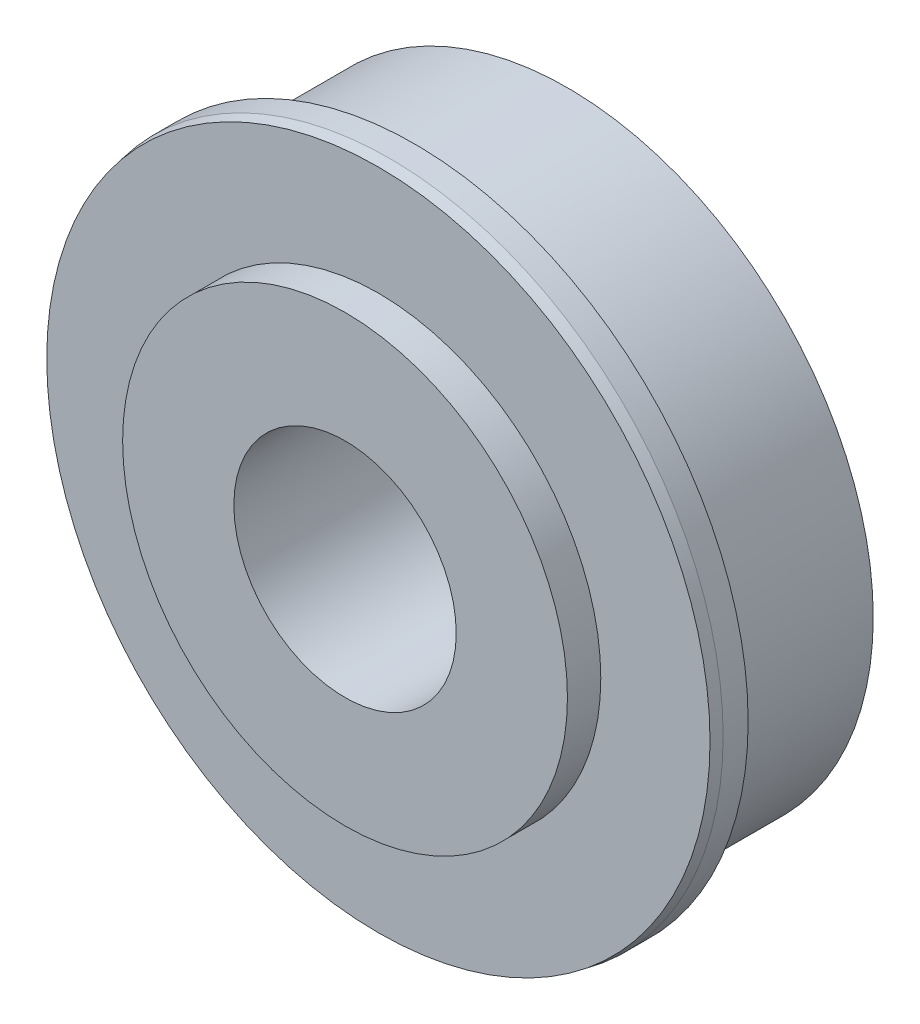
ISO-10303-21;
HEADER;
FILE_DESCRIPTION(('STEP AP214'),'2;1');
FILE_NAME('part.step','',(''),(''),'','','');
FILE_SCHEMA(('AUTOMOTIVE_DESIGN { 1 0 10303 214 1 1 1 1 }'));
ENDSEC;
DATA;
#1=APPLICATION_CONTEXT('core data for automotive mechanical design processes');
#2=APPLICATION_PROTOCOL_DEFINITION('international standard','automotive_design',2000,#1);
#3=PRODUCT_CONTEXT('',#1,'mechanical');
#4=PRODUCT('Part','Part','',(#3));
#5=PRODUCT_RELATED_PRODUCT_CATEGORY('part','',(#4));
#6=PRODUCT_DEFINITION_FORMATION('','',#4);
#7=PRODUCT_DEFINITION_CONTEXT('part definition',#1,'design');
#8=PRODUCT_DEFINITION('design','',#6,#7);
#9=PRODUCT_DEFINITION_SHAPE('','',#8);
#10=(LENGTH_UNIT() NAMED_UNIT(*) SI_UNIT(.MILLI.,.METRE.));
#11=(NAMED_UNIT(*) PLANE_ANGLE_UNIT() SI_UNIT($,.RADIAN.));
#12=(NAMED_UNIT(*) SI_UNIT($,.STERADIAN.) SOLID_ANGLE_UNIT());
#13=UNCERTAINTY_MEASURE_WITH_UNIT(LENGTH_MEASURE(1.E-05),#10,'distance_accuracy_value','');
#14=(GEOMETRIC_REPRESENTATION_CONTEXT(3) GLOBAL_UNCERTAINTY_ASSIGNED_CONTEXT((#13)) GLOBAL_UNIT_ASSIGNED_CONTEXT((#10,
#11,#12)) REPRESENTATION_CONTEXT('',''));
#15=CARTESIAN_POINT('',(0.,0.,0.));
#16=DIRECTION('',(0.,0.,1.));
#17=DIRECTION('',(1.,0.,0.));
#18=AXIS2_PLACEMENT_3D('',#15,#16,#17);
#19=CARTESIAN_POINT('',(17.4625,0.,-6.35));
#20=DIRECTION('',(0.,0.,-1.));
#21=DIRECTION('',(-1.,0.,0.));
#22=AXIS2_PLACEMENT_3D('',#19,#20,#21);
#23=PLANE('',#22);
#24=CARTESIAN_POINT('',(0.,0.,-6.34999999999999));
#25=DIRECTION('',(0.,0.,1.));
#26=DIRECTION('',(1.,0.,0.));
#27=AXIS2_PLACEMENT_3D('',#24,#25,#26);
#28=CIRCLE('',#27,6.34999999999998);
#29=CARTESIAN_POINT('',(6.34999999999998,0.,-6.34999999999999));
#30=VERTEX_POINT('',#29);
#31=EDGE_CURVE('E72',#30,#30,#28,.T.);
#32=ORIENTED_EDGE('',*,*,#31,.T.);
#33=EDGE_LOOP('',(#32));
#34=FACE_BOUND('',#33,.T.);
#35=CARTESIAN_POINT('',(0.,0.,-6.34999999999999));
#36=DIRECTION('',(0.,0.,1.));
#37=DIRECTION('',(1.,0.,0.));
#38=AXIS2_PLACEMENT_3D('',#35,#36,#37);
#39=CIRCLE('',#38,17.4625);
#40=CARTESIAN_POINT('',(17.4625,0.,-6.34999999999999));
#41=VERTEX_POINT('',#40);
#42=EDGE_CURVE('E10',#41,#41,#39,.T.);
#43=ORIENTED_EDGE('',*,*,#42,.F.);
#44=EDGE_LOOP('',(#43));
#45=FACE_BOUND('',#44,.T.);
#46=ADVANCED_FACE('F40',(#34,#45),#23,.T.);
#47=CARTESIAN_POINT('',(0.,0.,114.851664885803));
#48=DIRECTION('',(0.,0.,1.));
#49=DIRECTION('',(1.,0.,0.));
#50=AXIS2_PLACEMENT_3D('',#47,#48,#49);
#51=CYLINDRICAL_SURFACE('',#50,17.4625);
#52=ORIENTED_EDGE('',*,*,#42,.T.);
#53=EDGE_LOOP('',(#52));
#54=FACE_BOUND('',#53,.T.);
#55=CARTESIAN_POINT('',(0.,0.,1.74625));
#56=DIRECTION('',(0.,0.,1.));
#57=DIRECTION('',(1.,0.,0.));
#58=AXIS2_PLACEMENT_3D('',#55,#56,#57);
#59=CIRCLE('',#58,17.4625);
#60=CARTESIAN_POINT('',(17.4625,0.,1.74625));
#61=VERTEX_POINT('',#60);
#62=EDGE_CURVE('E43',#61,#61,#59,.T.);
#63=ORIENTED_EDGE('',*,*,#62,.F.);
#64=EDGE_LOOP('',(#63));
#65=FACE_BOUND('',#64,.T.);
#66=ADVANCED_FACE('F87',(#54,#65),#51,.T.);
#67=CARTESIAN_POINT('',(0.,0.,2.38125));
#68=DIRECTION('',(0.,0.,-1.));
#69=DIRECTION('',(-1.,0.,0.));
#70=AXIS2_PLACEMENT_3D('',#67,#68,#69);
#71=CONICAL_SURFACE('',#70,17.3505323672501,0.174532925199432);
#72=ORIENTED_EDGE('',*,*,#62,.T.);
#73=EDGE_LOOP('',(#72));
#74=FACE_BOUND('',#73,.T.);
#75=CARTESIAN_POINT('',(0.,0.,2.38125));
#76=DIRECTION('',(0.,0.,1.));
#77=DIRECTION('',(1.,0.,0.));
#78=AXIS2_PLACEMENT_3D('',#75,#76,#77);
#79=CIRCLE('',#78,17.3505323672501);
#80=CARTESIAN_POINT('',(17.3505323672501,0.,2.38125));
#81=VERTEX_POINT('',#80);
#82=EDGE_CURVE('E50',#81,#81,#79,.T.);
#83=ORIENTED_EDGE('',*,*,#82,.F.);
#84=EDGE_LOOP('',(#83));
#85=FACE_BOUND('',#84,.T.);
#86=ADVANCED_FACE('F93',(#74,#85),#71,.T.);
#87=CARTESIAN_POINT('',(17.3505323672501,0.,2.38125));
#88=DIRECTION('',(0.,0.,-1.));
#89=DIRECTION('',(-1.,0.,0.));
#90=AXIS2_PLACEMENT_3D('',#87,#88,#89);
#91=PLANE('',#90);
#92=ORIENTED_EDGE('',*,*,#82,.T.);
#93=EDGE_LOOP('',(#92));
#94=FACE_BOUND('',#93,.T.);
#95=CARTESIAN_POINT('',(0.,0.,2.38125));
#96=DIRECTION('',(0.,0.,1.));
#97=DIRECTION('',(1.,0.,0.));
#98=AXIS2_PLACEMENT_3D('',#95,#96,#97);
#99=CIRCLE('',#98,19.05);
#100=CARTESIAN_POINT('',(19.05,0.,2.38125));
#101=VERTEX_POINT('',#100);
#102=EDGE_CURVE('E51',#101,#101,#99,.T.);
#103=ORIENTED_EDGE('',*,*,#102,.F.);
#104=EDGE_LOOP('',(#103));
#105=FACE_BOUND('',#104,.T.);
#106=ADVANCED_FACE('F100',(#94,#105),#91,.T.);
#107=CARTESIAN_POINT('',(0.,0.,114.851664885803));
#108=DIRECTION('',(0.,0.,1.));
#109=DIRECTION('',(1.,0.,0.));
#110=AXIS2_PLACEMENT_3D('',#107,#108,#109);
#111=CYLINDRICAL_SURFACE('',#110,19.05);
#112=ORIENTED_EDGE('',*,*,#102,.T.);
#113=EDGE_LOOP('',(#112));
#114=FACE_BOUND('',#113,.T.);
#115=CARTESIAN_POINT('',(0.,0.,3.80999999999999));
#116=DIRECTION('',(0.,0.,1.));
#117=DIRECTION('',(1.,0.,0.));
#118=AXIS2_PLACEMENT_3D('',#115,#116,#117);
#119=CIRCLE('',#118,19.05);
#120=CARTESIAN_POINT('',(19.05,0.,3.80999999999999));
#121=VERTEX_POINT('',#120);
#122=EDGE_CURVE('E57',#121,#121,#119,.T.);
#123=ORIENTED_EDGE('',*,*,#122,.F.);
#124=EDGE_LOOP('',(#123));
#125=FACE_BOUND('',#124,.T.);
#126=ADVANCED_FACE('F104',(#114,#125),#111,.T.);
#127=CARTESIAN_POINT('',(0.,0.,4.445));
#128=DIRECTION('',(0.,0.,-1.));
#129=DIRECTION('',(-1.,0.,0.));
#130=AXIS2_PLACEMENT_3D('',#127,#128,#129);
#131=CONICAL_SURFACE('',#130,18.9380323672501,0.174532925199434);
#132=ORIENTED_EDGE('',*,*,#122,.T.);
#133=EDGE_LOOP('',(#132));
#134=FACE_BOUND('',#133,.T.);
#135=CARTESIAN_POINT('',(0.,0.,4.445));
#136=DIRECTION('',(0.,0.,1.));
#137=DIRECTION('',(1.,0.,0.));
#138=AXIS2_PLACEMENT_3D('',#135,#136,#137);
#139=CIRCLE('',#138,18.9380323672501);
#140=CARTESIAN_POINT('',(18.9380323672501,0.,4.445));
#141=VERTEX_POINT('',#140);
#142=EDGE_CURVE('E56',#141,#141,#139,.T.);
#143=ORIENTED_EDGE('',*,*,#142,.F.);
#144=EDGE_LOOP('',(#143));
#145=FACE_BOUND('',#144,.T.);
#146=ADVANCED_FACE('F109',(#134,#145),#131,.T.);
#147=CARTESIAN_POINT('',(18.9380323672501,0.,4.445));
#148=DIRECTION('',(0.,0.,1.));
#149=DIRECTION('',(1.,0.,0.));
#150=AXIS2_PLACEMENT_3D('',#147,#148,#149);
#151=PLANE('',#150);
#152=ORIENTED_EDGE('',*,*,#142,.T.);
#153=EDGE_LOOP('',(#152));
#154=FACE_BOUND('',#153,.T.);
#155=CARTESIAN_POINT('',(0.,0.,4.445));
#156=DIRECTION('',(0.,0.,1.));
#157=DIRECTION('',(1.,0.,0.));
#158=AXIS2_PLACEMENT_3D('',#155,#156,#157);
#159=CIRCLE('',#158,12.7);
#160=CARTESIAN_POINT('',(12.7,0.,4.445));
#161=VERTEX_POINT('',#160);
#162=EDGE_CURVE('E64',#161,#161,#159,.T.);
#163=ORIENTED_EDGE('',*,*,#162,.F.);
#164=EDGE_LOOP('',(#163));
#165=FACE_BOUND('',#164,.T.);
#166=ADVANCED_FACE('F112',(#154,#165),#151,.T.);
#167=CARTESIAN_POINT('',(0.,0.,114.851664885803));
#168=DIRECTION('',(0.,0.,1.));
#169=DIRECTION('',(1.,0.,0.));
#170=AXIS2_PLACEMENT_3D('',#167,#168,#169);
#171=CYLINDRICAL_SURFACE('',#170,12.7);
#172=ORIENTED_EDGE('',*,*,#162,.T.);
#173=EDGE_LOOP('',(#172));
#174=FACE_BOUND('',#173,.T.);
#175=CARTESIAN_POINT('',(0.,0.,6.34999999999999));
#176=DIRECTION('',(0.,0.,1.));
#177=DIRECTION('',(1.,0.,0.));
#178=AXIS2_PLACEMENT_3D('',#175,#176,#177);
#179=CIRCLE('',#178,12.7);
#180=CARTESIAN_POINT('',(12.7,0.,6.34999999999999));
#181=VERTEX_POINT('',#180);
#182=EDGE_CURVE('E63',#181,#181,#179,.T.);
#183=ORIENTED_EDGE('',*,*,#182,.F.);
#184=EDGE_LOOP('',(#183));
#185=FACE_BOUND('',#184,.T.);
#186=ADVANCED_FACE('F82',(#174,#185),#171,.T.);
#187=CARTESIAN_POINT('',(12.7,0.,6.35));
#188=DIRECTION('',(0.,0.,1.));
#189=DIRECTION('',(1.,0.,0.));
#190=AXIS2_PLACEMENT_3D('',#187,#188,#189);
#191=PLANE('',#190);
#192=ORIENTED_EDGE('',*,*,#182,.T.);
#193=EDGE_LOOP('',(#192));
#194=FACE_BOUND('',#193,.T.);
#195=CARTESIAN_POINT('',(0.,0.,6.34999999999999));
#196=DIRECTION('',(0.,0.,1.));
#197=DIRECTION('',(1.,0.,0.));
#198=AXIS2_PLACEMENT_3D('',#195,#196,#197);
#199=CIRCLE('',#198,6.34999999999998);
#200=CARTESIAN_POINT('',(6.34999999999998,0.,6.34999999999999));
#201=VERTEX_POINT('',#200);
#202=EDGE_CURVE('E66',#201,#201,#199,.T.);
#203=ORIENTED_EDGE('',*,*,#202,.F.);
#204=EDGE_LOOP('',(#203));
#205=FACE_BOUND('',#204,.T.);
#206=ADVANCED_FACE('F80',(#194,#205),#191,.T.);
#207=CARTESIAN_POINT('',(0.,0.,114.851664885803));
#208=DIRECTION('',(0.,0.,1.));
#209=DIRECTION('',(1.,0.,0.));
#210=AXIS2_PLACEMENT_3D('',#207,#208,#209);
#211=CYLINDRICAL_SURFACE('',#210,6.34999999999998);
#212=ORIENTED_EDGE('',*,*,#202,.T.);
#213=EDGE_LOOP('',(#212));
#214=FACE_BOUND('',#213,.T.);
#215=ORIENTED_EDGE('',*,*,#31,.F.);
#216=EDGE_LOOP('',(#215));
#217=FACE_BOUND('',#216,.T.);
#218=ADVANCED_FACE('F77',(#214,#217),#211,.F.);
#219=CLOSED_SHELL('',(#46,#66,#86,#106,#126,#146,#166,#186,#206,#218));
#220=MANIFOLD_SOLID_BREP('B2',#219);
#221=ADVANCED_BREP_SHAPE_REPRESENTATION('',(#18,#220),#14);
#222=SHAPE_DEFINITION_REPRESENTATION(#9,#221);
ENDSEC;
END-ISO-10303-21;
